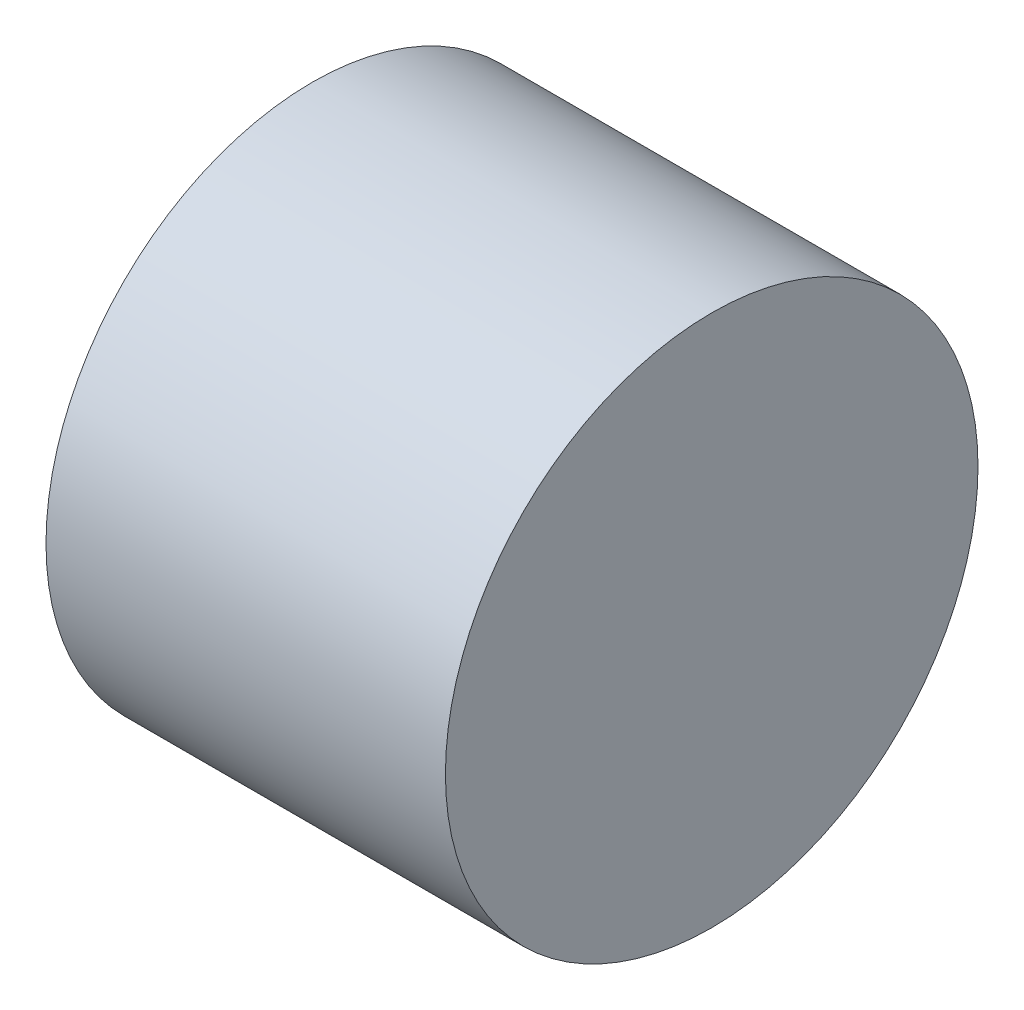
ISO-10303-21;
HEADER;
FILE_DESCRIPTION(('STEP AP214'),'2;1');
FILE_NAME('part.step','',(''),(''),'','','');
FILE_SCHEMA(('AUTOMOTIVE_DESIGN { 1 0 10303 214 1 1 1 1 }'));
ENDSEC;
DATA;
#1=APPLICATION_CONTEXT('core data for automotive mechanical design processes');
#2=APPLICATION_PROTOCOL_DEFINITION('international standard','automotive_design',2000,#1);
#3=PRODUCT_CONTEXT('',#1,'mechanical');
#4=PRODUCT('Part','Part','',(#3));
#5=PRODUCT_RELATED_PRODUCT_CATEGORY('part','',(#4));
#6=PRODUCT_DEFINITION_FORMATION('','',#4);
#7=PRODUCT_DEFINITION_CONTEXT('part definition',#1,'design');
#8=PRODUCT_DEFINITION('design','',#6,#7);
#9=PRODUCT_DEFINITION_SHAPE('','',#8);
#10=(LENGTH_UNIT() NAMED_UNIT(*) SI_UNIT(.MILLI.,.METRE.));
#11=(NAMED_UNIT(*) PLANE_ANGLE_UNIT() SI_UNIT($,.RADIAN.));
#12=(NAMED_UNIT(*) SI_UNIT($,.STERADIAN.) SOLID_ANGLE_UNIT());
#13=UNCERTAINTY_MEASURE_WITH_UNIT(LENGTH_MEASURE(1.E-05),#10,'distance_accuracy_value','');
#14=(GEOMETRIC_REPRESENTATION_CONTEXT(3) GLOBAL_UNCERTAINTY_ASSIGNED_CONTEXT((#13)) GLOBAL_UNIT_ASSIGNED_CONTEXT((#10,
#11,#12)) REPRESENTATION_CONTEXT('',''));
#15=CARTESIAN_POINT('',(0.,0.,0.));
#16=DIRECTION('',(0.,0.,1.));
#17=DIRECTION('',(1.,0.,0.));
#18=AXIS2_PLACEMENT_3D('',#15,#16,#17);
#19=CARTESIAN_POINT('',(30.,0.,0.));
#20=DIRECTION('',(-1.,0.,0.));
#21=DIRECTION('',(0.,0.,1.));
#22=AXIS2_PLACEMENT_3D('',#19,#20,#21);
#23=CYLINDRICAL_SURFACE('',#22,20.);
#24=CARTESIAN_POINT('',(30.,0.,0.));
#25=DIRECTION('',(1.,0.,0.));
#26=DIRECTION('',(0.,0.,-1.));
#27=AXIS2_PLACEMENT_3D('',#24,#25,#26);
#28=CIRCLE('',#27,20.);
#29=CARTESIAN_POINT('',(30.,0.,-20.));
#30=VERTEX_POINT('',#29);
#31=EDGE_CURVE('E10',#30,#30,#28,.T.);
#32=ORIENTED_EDGE('',*,*,#31,.F.);
#33=EDGE_LOOP('',(#32));
#34=FACE_BOUND('',#33,.T.);
#35=CARTESIAN_POINT('',(0.,0.,0.));
#36=DIRECTION('',(1.,0.,0.));
#37=DIRECTION('',(0.,0.,-1.));
#38=AXIS2_PLACEMENT_3D('',#35,#36,#37);
#39=CIRCLE('',#38,20.);
#40=CARTESIAN_POINT('',(0.,0.,-20.));
#41=VERTEX_POINT('',#40);
#42=EDGE_CURVE('E32',#41,#41,#39,.T.);
#43=ORIENTED_EDGE('',*,*,#42,.T.);
#44=EDGE_LOOP('',(#43));
#45=FACE_BOUND('',#44,.T.);
#46=ADVANCED_FACE('F29',(#34,#45),#23,.T.);
#47=CARTESIAN_POINT('',(30.,0.,0.));
#48=DIRECTION('',(1.,0.,0.));
#49=DIRECTION('',(0.,0.,-1.));
#50=AXIS2_PLACEMENT_3D('',#47,#48,#49);
#51=PLANE('',#50);
#52=ORIENTED_EDGE('',*,*,#31,.T.);
#53=EDGE_LOOP('',(#52));
#54=FACE_BOUND('',#53,.T.);
#55=ADVANCED_FACE('F44',(#54),#51,.T.);
#56=CARTESIAN_POINT('',(0.,0.,0.));
#57=DIRECTION('',(1.,0.,0.));
#58=DIRECTION('',(0.,0.,-1.));
#59=AXIS2_PLACEMENT_3D('',#56,#57,#58);
#60=PLANE('',#59);
#61=ORIENTED_EDGE('',*,*,#42,.F.);
#62=EDGE_LOOP('',(#61));
#63=FACE_BOUND('',#62,.T.);
#64=ADVANCED_FACE('F42',(#63),#60,.F.);
#65=CLOSED_SHELL('',(#46,#55,#64));
#66=MANIFOLD_SOLID_BREP('B2',#65);
#67=ADVANCED_BREP_SHAPE_REPRESENTATION('',(#18,#66),#14);
#68=SHAPE_DEFINITION_REPRESENTATION(#9,#67);
ENDSEC;
END-ISO-10303-21;
